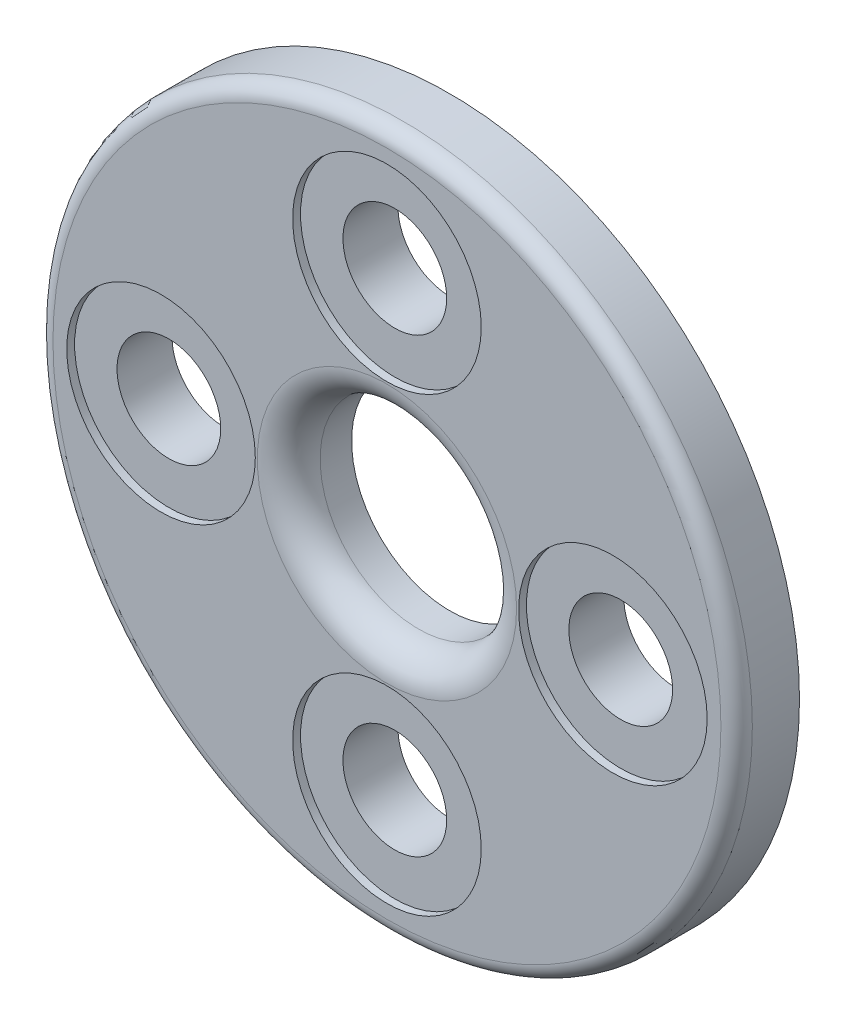
ISO-10303-21;
HEADER;
FILE_DESCRIPTION(('STEP AP214'),'2;1');
FILE_NAME('part.step','',(''),(''),'','','');
FILE_SCHEMA(('AUTOMOTIVE_DESIGN { 1 0 10303 214 1 1 1 1 }'));
ENDSEC;
DATA;
#1=APPLICATION_CONTEXT('core data for automotive mechanical design processes');
#2=APPLICATION_PROTOCOL_DEFINITION('international standard','automotive_design',2000,#1);
#3=PRODUCT_CONTEXT('',#1,'mechanical');
#4=PRODUCT('Part','Part','',(#3));
#5=PRODUCT_RELATED_PRODUCT_CATEGORY('part','',(#4));
#6=PRODUCT_DEFINITION_FORMATION('','',#4);
#7=PRODUCT_DEFINITION_CONTEXT('part definition',#1,'design');
#8=PRODUCT_DEFINITION('design','',#6,#7);
#9=PRODUCT_DEFINITION_SHAPE('','',#8);
#10=(LENGTH_UNIT() NAMED_UNIT(*) SI_UNIT(.MILLI.,.METRE.));
#11=(NAMED_UNIT(*) PLANE_ANGLE_UNIT() SI_UNIT($,.RADIAN.));
#12=(NAMED_UNIT(*) SI_UNIT($,.STERADIAN.) SOLID_ANGLE_UNIT());
#13=UNCERTAINTY_MEASURE_WITH_UNIT(LENGTH_MEASURE(1.E-05),#10,'distance_accuracy_value','');
#14=(GEOMETRIC_REPRESENTATION_CONTEXT(3) GLOBAL_UNCERTAINTY_ASSIGNED_CONTEXT((#13)) GLOBAL_UNIT_ASSIGNED_CONTEXT((#10,
#11,#12)) REPRESENTATION_CONTEXT('',''));
#15=CARTESIAN_POINT('',(0.,0.,0.));
#16=DIRECTION('',(0.,0.,1.));
#17=DIRECTION('',(1.,0.,0.));
#18=AXIS2_PLACEMENT_3D('',#15,#16,#17);
#19=CARTESIAN_POINT('',(0.,0.,4.));
#20=DIRECTION('',(0.,0.,1.));
#21=DIRECTION('',(1.,0.,0.));
#22=AXIS2_PLACEMENT_3D('',#19,#20,#21);
#23=PLANE('',#22);
#24=CARTESIAN_POINT('',(0.,0.,4.));
#25=DIRECTION('',(0.,0.,1.));
#26=DIRECTION('',(1.,0.,0.));
#27=AXIS2_PLACEMENT_3D('',#24,#25,#26);
#28=CIRCLE('',#27,8.25);
#29=CARTESIAN_POINT('',(8.25,0.,4.));
#30=VERTEX_POINT('',#29);
#31=EDGE_CURVE('E10',#30,#30,#28,.F.);
#32=ORIENTED_EDGE('',*,*,#31,.T.);
#33=EDGE_LOOP('',(#32));
#34=FACE_BOUND('',#33,.T.);
#35=CARTESIAN_POINT('',(0.,0.,4.));
#36=DIRECTION('',(0.,0.,1.));
#37=DIRECTION('',(1.,0.,0.));
#38=AXIS2_PLACEMENT_3D('',#35,#36,#37);
#39=CIRCLE('',#38,21.25);
#40=CARTESIAN_POINT('',(21.25,0.,4.));
#41=VERTEX_POINT('',#40);
#42=EDGE_CURVE('E51',#41,#41,#39,.T.);
#43=ORIENTED_EDGE('',*,*,#42,.T.);
#44=EDGE_LOOP('',(#43));
#45=FACE_BOUND('',#44,.T.);
#46=CARTESIAN_POINT('',(0.,14.375,4.));
#47=DIRECTION('',(0.,0.,1.));
#48=DIRECTION('',(1.,0.,0.));
#49=AXIS2_PLACEMENT_3D('',#46,#47,#48);
#50=CIRCLE('',#49,6.);
#51=CARTESIAN_POINT('',(6.,14.375,4.));
#52=VERTEX_POINT('',#51);
#53=EDGE_CURVE('E107',#52,#52,#50,.T.);
#54=ORIENTED_EDGE('',*,*,#53,.F.);
#55=EDGE_LOOP('',(#54));
#56=FACE_BOUND('',#55,.T.);
#57=CARTESIAN_POINT('',(14.375,0.,4.));
#58=DIRECTION('',(0.,0.,1.));
#59=DIRECTION('',(1.,0.,0.));
#60=AXIS2_PLACEMENT_3D('',#57,#58,#59);
#61=CIRCLE('',#60,6.);
#62=CARTESIAN_POINT('',(20.375,0.,4.));
#63=VERTEX_POINT('',#62);
#64=EDGE_CURVE('E95',#63,#63,#61,.T.);
#65=ORIENTED_EDGE('',*,*,#64,.F.);
#66=EDGE_LOOP('',(#65));
#67=FACE_BOUND('',#66,.T.);
#68=CARTESIAN_POINT('',(0.,-14.375,4.));
#69=DIRECTION('',(0.,0.,1.));
#70=DIRECTION('',(1.,0.,0.));
#71=AXIS2_PLACEMENT_3D('',#68,#69,#70);
#72=CIRCLE('',#71,6.);
#73=CARTESIAN_POINT('',(6.,-14.375,4.));
#74=VERTEX_POINT('',#73);
#75=EDGE_CURVE('E83',#74,#74,#72,.T.);
#76=ORIENTED_EDGE('',*,*,#75,.F.);
#77=EDGE_LOOP('',(#76));
#78=FACE_BOUND('',#77,.T.);
#79=CARTESIAN_POINT('',(-14.375,0.,4.));
#80=DIRECTION('',(0.,0.,1.));
#81=DIRECTION('',(1.,0.,0.));
#82=AXIS2_PLACEMENT_3D('',#79,#80,#81);
#83=CIRCLE('',#82,6.);
#84=CARTESIAN_POINT('',(-8.375,0.,4.));
#85=VERTEX_POINT('',#84);
#86=EDGE_CURVE('E71',#85,#85,#83,.T.);
#87=ORIENTED_EDGE('',*,*,#86,.F.);
#88=EDGE_LOOP('',(#87));
#89=FACE_BOUND('',#88,.T.);
#90=ADVANCED_FACE('F36',(#34,#45,#56,#67,#78,#89),#23,.T.);
#91=CARTESIAN_POINT('',(0.,0.,0.));
#92=DIRECTION('',(0.,0.,1.));
#93=DIRECTION('',(1.,0.,0.));
#94=AXIS2_PLACEMENT_3D('',#91,#92,#93);
#95=PLANE('',#94);
#96=CARTESIAN_POINT('',(0.,14.375,0.));
#97=DIRECTION('',(0.,0.,1.));
#98=DIRECTION('',(1.,0.,0.));
#99=AXIS2_PLACEMENT_3D('',#96,#97,#98);
#100=CIRCLE('',#99,3.3);
#101=CARTESIAN_POINT('',(3.3,14.375,0.));
#102=VERTEX_POINT('',#101);
#103=EDGE_CURVE('E98',#102,#102,#100,.T.);
#104=ORIENTED_EDGE('',*,*,#103,.T.);
#105=EDGE_LOOP('',(#104));
#106=FACE_BOUND('',#105,.T.);
#107=CARTESIAN_POINT('',(14.375,0.,0.));
#108=DIRECTION('',(0.,0.,1.));
#109=DIRECTION('',(1.,0.,0.));
#110=AXIS2_PLACEMENT_3D('',#107,#108,#109);
#111=CIRCLE('',#110,3.3);
#112=CARTESIAN_POINT('',(17.675,0.,0.));
#113=VERTEX_POINT('',#112);
#114=EDGE_CURVE('E86',#113,#113,#111,.T.);
#115=ORIENTED_EDGE('',*,*,#114,.T.);
#116=EDGE_LOOP('',(#115));
#117=FACE_BOUND('',#116,.T.);
#118=CARTESIAN_POINT('',(0.,-14.375,0.));
#119=DIRECTION('',(0.,0.,1.));
#120=DIRECTION('',(1.,0.,0.));
#121=AXIS2_PLACEMENT_3D('',#118,#119,#120);
#122=CIRCLE('',#121,3.3);
#123=CARTESIAN_POINT('',(3.3,-14.375,0.));
#124=VERTEX_POINT('',#123);
#125=EDGE_CURVE('E74',#124,#124,#122,.T.);
#126=ORIENTED_EDGE('',*,*,#125,.T.);
#127=EDGE_LOOP('',(#126));
#128=FACE_BOUND('',#127,.T.);
#129=CARTESIAN_POINT('',(-14.375,0.,0.));
#130=DIRECTION('',(0.,0.,1.));
#131=DIRECTION('',(1.,0.,0.));
#132=AXIS2_PLACEMENT_3D('',#129,#130,#131);
#133=CIRCLE('',#132,3.3);
#134=CARTESIAN_POINT('',(-11.075,0.,0.));
#135=VERTEX_POINT('',#134);
#136=EDGE_CURVE('E62',#135,#135,#133,.T.);
#137=ORIENTED_EDGE('',*,*,#136,.T.);
#138=EDGE_LOOP('',(#137));
#139=FACE_BOUND('',#138,.T.);
#140=CARTESIAN_POINT('',(0.,0.,0.));
#141=DIRECTION('',(0.,0.,1.));
#142=DIRECTION('',(1.,0.,0.));
#143=AXIS2_PLACEMENT_3D('',#140,#141,#142);
#144=CIRCLE('',#143,22.25);
#145=CARTESIAN_POINT('',(22.25,0.,0.));
#146=VERTEX_POINT('',#145);
#147=EDGE_CURVE('E56',#146,#146,#144,.T.);
#148=ORIENTED_EDGE('',*,*,#147,.F.);
#149=EDGE_LOOP('',(#148));
#150=FACE_BOUND('',#149,.T.);
#151=CARTESIAN_POINT('',(0.,0.,0.));
#152=DIRECTION('',(0.,0.,1.));
#153=DIRECTION('',(1.,0.,0.));
#154=AXIS2_PLACEMENT_3D('',#151,#152,#153);
#155=CIRCLE('',#154,6.25);
#156=CARTESIAN_POINT('',(6.25,0.,0.));
#157=VERTEX_POINT('',#156);
#158=EDGE_CURVE('E59',#157,#157,#155,.T.);
#159=ORIENTED_EDGE('',*,*,#158,.T.);
#160=EDGE_LOOP('',(#159));
#161=FACE_BOUND('',#160,.T.);
#162=ADVANCED_FACE('F115',(#106,#117,#128,#139,#150,#161),#95,.F.);
#163=CARTESIAN_POINT('',(0.,0.,4.));
#164=DIRECTION('',(0.,0.,-1.));
#165=DIRECTION('',(-1.,0.,0.));
#166=AXIS2_PLACEMENT_3D('',#163,#164,#165);
#167=CYLINDRICAL_SURFACE('',#166,22.25);
#168=CARTESIAN_POINT('',(0.,0.,3.));
#169=DIRECTION('',(0.,0.,1.));
#170=DIRECTION('',(1.,0.,0.));
#171=AXIS2_PLACEMENT_3D('',#168,#169,#170);
#172=CIRCLE('',#171,22.25);
#173=CARTESIAN_POINT('',(22.25,0.,3.));
#174=VERTEX_POINT('',#173);
#175=EDGE_CURVE('E47',#174,#174,#172,.F.);
#176=ORIENTED_EDGE('',*,*,#175,.T.);
#177=EDGE_LOOP('',(#176));
#178=FACE_BOUND('',#177,.T.);
#179=ORIENTED_EDGE('',*,*,#147,.T.);
#180=EDGE_LOOP('',(#179));
#181=FACE_BOUND('',#180,.T.);
#182=ADVANCED_FACE('F147',(#178,#181),#167,.T.);
#183=CARTESIAN_POINT('',(0.,0.,4.));
#184=DIRECTION('',(0.,0.,-1.));
#185=DIRECTION('',(-1.,0.,0.));
#186=AXIS2_PLACEMENT_3D('',#183,#184,#185);
#187=CYLINDRICAL_SURFACE('',#186,6.25);
#188=CARTESIAN_POINT('',(0.,0.,2.));
#189=DIRECTION('',(0.,0.,1.));
#190=DIRECTION('',(1.,0.,0.));
#191=AXIS2_PLACEMENT_3D('',#188,#189,#190);
#192=CIRCLE('',#191,6.25);
#193=CARTESIAN_POINT('',(6.25,0.,2.));
#194=VERTEX_POINT('',#193);
#195=EDGE_CURVE('E43',#194,#194,#192,.T.);
#196=ORIENTED_EDGE('',*,*,#195,.T.);
#197=EDGE_LOOP('',(#196));
#198=FACE_BOUND('',#197,.T.);
#199=ORIENTED_EDGE('',*,*,#158,.F.);
#200=EDGE_LOOP('',(#199));
#201=FACE_BOUND('',#200,.T.);
#202=ADVANCED_FACE('F144',(#198,#201),#187,.F.);
#203=CARTESIAN_POINT('',(-14.375,0.,4.));
#204=DIRECTION('',(0.,0.,1.));
#205=DIRECTION('',(1.,0.,0.));
#206=AXIS2_PLACEMENT_3D('',#203,#204,#205);
#207=CYLINDRICAL_SURFACE('',#206,3.3);
#208=ORIENTED_EDGE('',*,*,#136,.F.);
#209=EDGE_LOOP('',(#208));
#210=FACE_BOUND('',#209,.T.);
#211=CARTESIAN_POINT('',(-14.375,0.,3.5));
#212=DIRECTION('',(0.,0.,1.));
#213=DIRECTION('',(1.,0.,0.));
#214=AXIS2_PLACEMENT_3D('',#211,#212,#213);
#215=CIRCLE('',#214,3.3);
#216=CARTESIAN_POINT('',(-11.075,0.,3.5));
#217=VERTEX_POINT('',#216);
#218=EDGE_CURVE('E65',#217,#217,#215,.T.);
#219=ORIENTED_EDGE('',*,*,#218,.T.);
#220=EDGE_LOOP('',(#219));
#221=FACE_BOUND('',#220,.T.);
#222=ADVANCED_FACE('F136',(#210,#221),#207,.F.);
#223=CARTESIAN_POINT('',(-11.075,0.,3.5));
#224=DIRECTION('',(0.,0.,-1.));
#225=DIRECTION('',(-1.,0.,0.));
#226=AXIS2_PLACEMENT_3D('',#223,#224,#225);
#227=PLANE('',#226);
#228=ORIENTED_EDGE('',*,*,#218,.F.);
#229=EDGE_LOOP('',(#228));
#230=FACE_BOUND('',#229,.T.);
#231=CARTESIAN_POINT('',(-14.375,0.,3.5));
#232=DIRECTION('',(0.,0.,1.));
#233=DIRECTION('',(1.,0.,0.));
#234=AXIS2_PLACEMENT_3D('',#231,#232,#233);
#235=CIRCLE('',#234,6.);
#236=CARTESIAN_POINT('',(-8.375,0.,3.5));
#237=VERTEX_POINT('',#236);
#238=EDGE_CURVE('E68',#237,#237,#235,.T.);
#239=ORIENTED_EDGE('',*,*,#238,.T.);
#240=EDGE_LOOP('',(#239));
#241=FACE_BOUND('',#240,.T.);
#242=ADVANCED_FACE('F126',(#230,#241),#227,.F.);
#243=CARTESIAN_POINT('',(-14.375,0.,4.));
#244=DIRECTION('',(0.,0.,1.));
#245=DIRECTION('',(1.,0.,0.));
#246=AXIS2_PLACEMENT_3D('',#243,#244,#245);
#247=CYLINDRICAL_SURFACE('',#246,6.);
#248=ORIENTED_EDGE('',*,*,#238,.F.);
#249=EDGE_LOOP('',(#248));
#250=FACE_BOUND('',#249,.T.);
#251=ORIENTED_EDGE('',*,*,#86,.T.);
#252=EDGE_LOOP('',(#251));
#253=FACE_BOUND('',#252,.T.);
#254=ADVANCED_FACE('F123',(#250,#253),#247,.F.);
#255=CARTESIAN_POINT('',(0.,-14.375,4.));
#256=DIRECTION('',(0.,0.,1.));
#257=DIRECTION('',(1.,0.,0.));
#258=AXIS2_PLACEMENT_3D('',#255,#256,#257);
#259=CYLINDRICAL_SURFACE('',#258,3.3);
#260=ORIENTED_EDGE('',*,*,#125,.F.);
#261=EDGE_LOOP('',(#260));
#262=FACE_BOUND('',#261,.T.);
#263=CARTESIAN_POINT('',(0.,-14.375,3.5));
#264=DIRECTION('',(0.,0.,1.));
#265=DIRECTION('',(1.,0.,0.));
#266=AXIS2_PLACEMENT_3D('',#263,#264,#265);
#267=CIRCLE('',#266,3.3);
#268=CARTESIAN_POINT('',(3.3,-14.375,3.5));
#269=VERTEX_POINT('',#268);
#270=EDGE_CURVE('E77',#269,#269,#267,.T.);
#271=ORIENTED_EDGE('',*,*,#270,.T.);
#272=EDGE_LOOP('',(#271));
#273=FACE_BOUND('',#272,.T.);
#274=ADVANCED_FACE('F125',(#262,#273),#259,.F.);
#275=CARTESIAN_POINT('',(3.3,-14.375,3.5));
#276=DIRECTION('',(0.,0.,-1.));
#277=DIRECTION('',(-1.,0.,0.));
#278=AXIS2_PLACEMENT_3D('',#275,#276,#277);
#279=PLANE('',#278);
#280=ORIENTED_EDGE('',*,*,#270,.F.);
#281=EDGE_LOOP('',(#280));
#282=FACE_BOUND('',#281,.T.);
#283=CARTESIAN_POINT('',(0.,-14.375,3.5));
#284=DIRECTION('',(0.,0.,1.));
#285=DIRECTION('',(1.,0.,0.));
#286=AXIS2_PLACEMENT_3D('',#283,#284,#285);
#287=CIRCLE('',#286,6.);
#288=CARTESIAN_POINT('',(6.,-14.375,3.5));
#289=VERTEX_POINT('',#288);
#290=EDGE_CURVE('E80',#289,#289,#287,.T.);
#291=ORIENTED_EDGE('',*,*,#290,.T.);
#292=EDGE_LOOP('',(#291));
#293=FACE_BOUND('',#292,.T.);
#294=ADVANCED_FACE('F133',(#282,#293),#279,.F.);
#295=CARTESIAN_POINT('',(0.,-14.375,4.));
#296=DIRECTION('',(0.,0.,1.));
#297=DIRECTION('',(1.,0.,0.));
#298=AXIS2_PLACEMENT_3D('',#295,#296,#297);
#299=CYLINDRICAL_SURFACE('',#298,6.);
#300=ORIENTED_EDGE('',*,*,#290,.F.);
#301=EDGE_LOOP('',(#300));
#302=FACE_BOUND('',#301,.T.);
#303=ORIENTED_EDGE('',*,*,#75,.T.);
#304=EDGE_LOOP('',(#303));
#305=FACE_BOUND('',#304,.T.);
#306=ADVANCED_FACE('F197',(#302,#305),#299,.F.);
#307=CARTESIAN_POINT('',(14.375,0.,4.));
#308=DIRECTION('',(0.,0.,1.));
#309=DIRECTION('',(1.,0.,0.));
#310=AXIS2_PLACEMENT_3D('',#307,#308,#309);
#311=CYLINDRICAL_SURFACE('',#310,3.3);
#312=ORIENTED_EDGE('',*,*,#114,.F.);
#313=EDGE_LOOP('',(#312));
#314=FACE_BOUND('',#313,.T.);
#315=CARTESIAN_POINT('',(14.375,0.,3.5));
#316=DIRECTION('',(0.,0.,1.));
#317=DIRECTION('',(1.,0.,0.));
#318=AXIS2_PLACEMENT_3D('',#315,#316,#317);
#319=CIRCLE('',#318,3.3);
#320=CARTESIAN_POINT('',(17.675,0.,3.5));
#321=VERTEX_POINT('',#320);
#322=EDGE_CURVE('E89',#321,#321,#319,.T.);
#323=ORIENTED_EDGE('',*,*,#322,.T.);
#324=EDGE_LOOP('',(#323));
#325=FACE_BOUND('',#324,.T.);
#326=ADVANCED_FACE('F193',(#314,#325),#311,.F.);
#327=CARTESIAN_POINT('',(17.675,0.,3.5));
#328=DIRECTION('',(0.,0.,-1.));
#329=DIRECTION('',(-1.,0.,0.));
#330=AXIS2_PLACEMENT_3D('',#327,#328,#329);
#331=PLANE('',#330);
#332=ORIENTED_EDGE('',*,*,#322,.F.);
#333=EDGE_LOOP('',(#332));
#334=FACE_BOUND('',#333,.T.);
#335=CARTESIAN_POINT('',(14.375,0.,3.5));
#336=DIRECTION('',(0.,0.,1.));
#337=DIRECTION('',(1.,0.,0.));
#338=AXIS2_PLACEMENT_3D('',#335,#336,#337);
#339=CIRCLE('',#338,6.);
#340=CARTESIAN_POINT('',(20.375,0.,3.5));
#341=VERTEX_POINT('',#340);
#342=EDGE_CURVE('E92',#341,#341,#339,.T.);
#343=ORIENTED_EDGE('',*,*,#342,.T.);
#344=EDGE_LOOP('',(#343));
#345=FACE_BOUND('',#344,.T.);
#346=ADVANCED_FACE('F189',(#334,#345),#331,.F.);
#347=CARTESIAN_POINT('',(14.375,0.,4.));
#348=DIRECTION('',(0.,0.,1.));
#349=DIRECTION('',(1.,0.,0.));
#350=AXIS2_PLACEMENT_3D('',#347,#348,#349);
#351=CYLINDRICAL_SURFACE('',#350,6.);
#352=ORIENTED_EDGE('',*,*,#342,.F.);
#353=EDGE_LOOP('',(#352));
#354=FACE_BOUND('',#353,.T.);
#355=ORIENTED_EDGE('',*,*,#64,.T.);
#356=EDGE_LOOP('',(#355));
#357=FACE_BOUND('',#356,.T.);
#358=ADVANCED_FACE('F185',(#354,#357),#351,.F.);
#359=CARTESIAN_POINT('',(0.,14.375,4.));
#360=DIRECTION('',(0.,0.,1.));
#361=DIRECTION('',(1.,0.,0.));
#362=AXIS2_PLACEMENT_3D('',#359,#360,#361);
#363=CYLINDRICAL_SURFACE('',#362,3.3);
#364=ORIENTED_EDGE('',*,*,#103,.F.);
#365=EDGE_LOOP('',(#364));
#366=FACE_BOUND('',#365,.T.);
#367=CARTESIAN_POINT('',(0.,14.375,3.5));
#368=DIRECTION('',(0.,0.,1.));
#369=DIRECTION('',(1.,0.,0.));
#370=AXIS2_PLACEMENT_3D('',#367,#368,#369);
#371=CIRCLE('',#370,3.3);
#372=CARTESIAN_POINT('',(3.3,14.375,3.5));
#373=VERTEX_POINT('',#372);
#374=EDGE_CURVE('E101',#373,#373,#371,.T.);
#375=ORIENTED_EDGE('',*,*,#374,.T.);
#376=EDGE_LOOP('',(#375));
#377=FACE_BOUND('',#376,.T.);
#378=ADVANCED_FACE('F178',(#366,#377),#363,.F.);
#379=CARTESIAN_POINT('',(3.3,14.375,3.5));
#380=DIRECTION('',(0.,0.,-1.));
#381=DIRECTION('',(-1.,0.,0.));
#382=AXIS2_PLACEMENT_3D('',#379,#380,#381);
#383=PLANE('',#382);
#384=ORIENTED_EDGE('',*,*,#374,.F.);
#385=EDGE_LOOP('',(#384));
#386=FACE_BOUND('',#385,.T.);
#387=CARTESIAN_POINT('',(0.,14.375,3.5));
#388=DIRECTION('',(0.,0.,1.));
#389=DIRECTION('',(1.,0.,0.));
#390=AXIS2_PLACEMENT_3D('',#387,#388,#389);
#391=CIRCLE('',#390,6.);
#392=CARTESIAN_POINT('',(6.,14.375,3.5));
#393=VERTEX_POINT('',#392);
#394=EDGE_CURVE('E104',#393,#393,#391,.T.);
#395=ORIENTED_EDGE('',*,*,#394,.T.);
#396=EDGE_LOOP('',(#395));
#397=FACE_BOUND('',#396,.T.);
#398=ADVANCED_FACE('F162',(#386,#397),#383,.F.);
#399=CARTESIAN_POINT('',(0.,14.375,4.));
#400=DIRECTION('',(0.,0.,1.));
#401=DIRECTION('',(1.,0.,0.));
#402=AXIS2_PLACEMENT_3D('',#399,#400,#401);
#403=CYLINDRICAL_SURFACE('',#402,6.);
#404=ORIENTED_EDGE('',*,*,#394,.F.);
#405=EDGE_LOOP('',(#404));
#406=FACE_BOUND('',#405,.T.);
#407=ORIENTED_EDGE('',*,*,#53,.T.);
#408=EDGE_LOOP('',(#407));
#409=FACE_BOUND('',#408,.T.);
#410=ADVANCED_FACE('F111',(#406,#409),#403,.F.);
#411=CARTESIAN_POINT('',(0.,0.,3.));
#412=DIRECTION('',(0.,0.,1.));
#413=DIRECTION('',(1.,0.,0.));
#414=AXIS2_PLACEMENT_3D('',#411,#412,#413);
#415=TOROIDAL_SURFACE('',#414,21.25,1.);
#416=ORIENTED_EDGE('',*,*,#175,.F.);
#417=EDGE_LOOP('',(#416));
#418=FACE_BOUND('',#417,.T.);
#419=ORIENTED_EDGE('',*,*,#42,.F.);
#420=EDGE_LOOP('',(#419));
#421=FACE_BOUND('',#420,.T.);
#422=ADVANCED_FACE('F154',(#418,#421),#415,.T.);
#423=CARTESIAN_POINT('',(0.,0.,2.));
#424=DIRECTION('',(0.,0.,1.));
#425=DIRECTION('',(1.,0.,0.));
#426=AXIS2_PLACEMENT_3D('',#423,#424,#425);
#427=TOROIDAL_SURFACE('',#426,8.25,2.);
#428=ORIENTED_EDGE('',*,*,#31,.F.);
#429=EDGE_LOOP('',(#428));
#430=FACE_BOUND('',#429,.T.);
#431=ORIENTED_EDGE('',*,*,#195,.F.);
#432=EDGE_LOOP('',(#431));
#433=FACE_BOUND('',#432,.T.);
#434=ADVANCED_FACE('F38',(#430,#433),#427,.T.);
#435=CLOSED_SHELL('',(#90,#162,#182,#202,#222,#242,#254,#274,#294,#306,#326,#346,#358,#378,#398,
#410,#422,#434));
#436=MANIFOLD_SOLID_BREP('B2',#435);
#437=ADVANCED_BREP_SHAPE_REPRESENTATION('',(#18,#436),#14);
#438=SHAPE_DEFINITION_REPRESENTATION(#9,#437);
ENDSEC;
END-ISO-10303-21;
